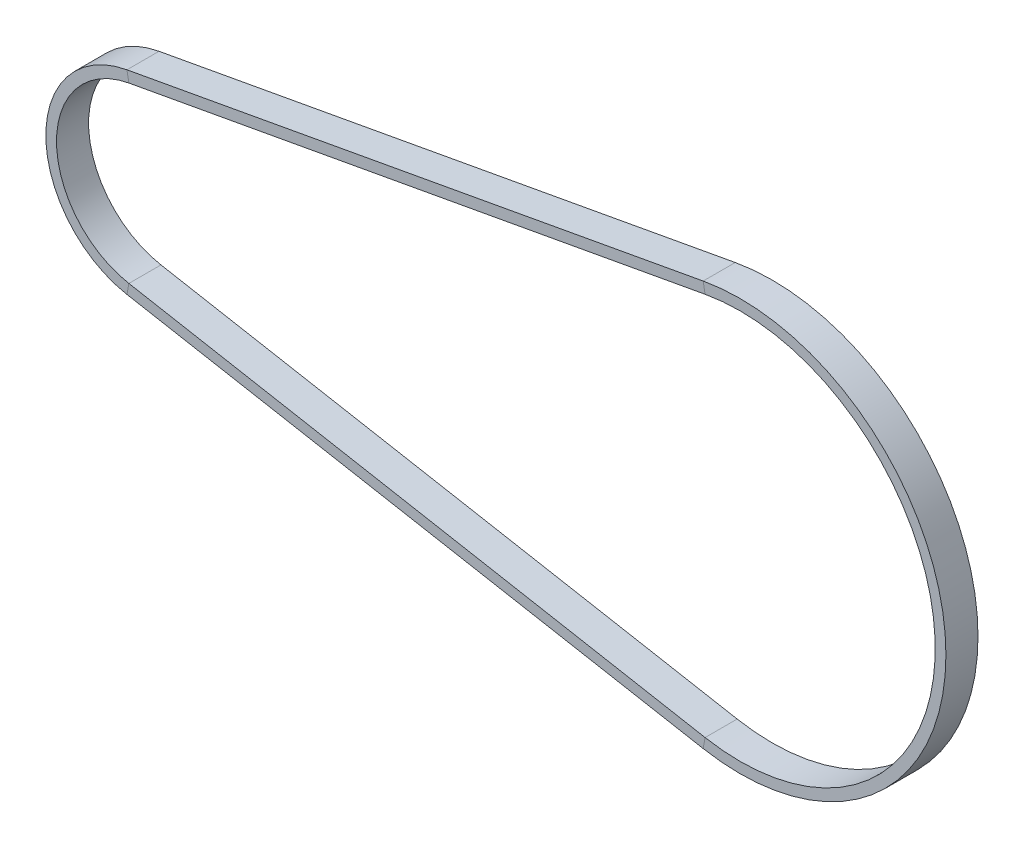
ISO-10303-21;
HEADER;
FILE_DESCRIPTION(('STEP AP214'),'2;1');
FILE_NAME('part.step','',(''),(''),'','','');
FILE_SCHEMA(('AUTOMOTIVE_DESIGN { 1 0 10303 214 1 1 1 1 }'));
ENDSEC;
DATA;
#1=APPLICATION_CONTEXT('core data for automotive mechanical design processes');
#2=APPLICATION_PROTOCOL_DEFINITION('international standard','automotive_design',2000,#1);
#3=PRODUCT_CONTEXT('',#1,'mechanical');
#4=PRODUCT('Part','Part','',(#3));
#5=PRODUCT_RELATED_PRODUCT_CATEGORY('part','',(#4));
#6=PRODUCT_DEFINITION_FORMATION('','',#4);
#7=PRODUCT_DEFINITION_CONTEXT('part definition',#1,'design');
#8=PRODUCT_DEFINITION('design','',#6,#7);
#9=PRODUCT_DEFINITION_SHAPE('','',#8);
#10=(LENGTH_UNIT() NAMED_UNIT(*) SI_UNIT(.MILLI.,.METRE.));
#11=(NAMED_UNIT(*) PLANE_ANGLE_UNIT() SI_UNIT($,.RADIAN.));
#12=(NAMED_UNIT(*) SI_UNIT($,.STERADIAN.) SOLID_ANGLE_UNIT());
#13=UNCERTAINTY_MEASURE_WITH_UNIT(LENGTH_MEASURE(1.E-05),#10,'distance_accuracy_value','');
#14=(GEOMETRIC_REPRESENTATION_CONTEXT(3) GLOBAL_UNCERTAINTY_ASSIGNED_CONTEXT((#13)) GLOBAL_UNIT_ASSIGNED_CONTEXT((#10,
#11,#12)) REPRESENTATION_CONTEXT('',''));
#15=CARTESIAN_POINT('',(0.,0.,0.));
#16=DIRECTION('',(0.,0.,1.));
#17=DIRECTION('',(1.,0.,0.));
#18=AXIS2_PLACEMENT_3D('',#15,#16,#17);
#19=CARTESIAN_POINT('',(-57.3205845497318,0.,0.));
#20=DIRECTION('',(0.,0.,-1.));
#21=DIRECTION('',(-1.,0.,0.));
#22=AXIS2_PLACEMENT_3D('',#19,#20,#21);
#23=CYLINDRICAL_SURFACE('',#22,16.5);
#24=CARTESIAN_POINT('',(-57.3205845497318,0.,3.));
#25=DIRECTION('',(0.,0.,-1.));
#26=DIRECTION('',(-0.179558490927269,-0.983747299023444,0.));
#27=AXIS2_PLACEMENT_3D('',#24,#25,#26);
#28=CIRCLE('',#27,16.5);
#29=CARTESIAN_POINT('',(-60.2832996500317,-16.2318304338868,3.));
#30=VERTEX_POINT('',#29);
#31=CARTESIAN_POINT('',(-60.2832996500317,16.2318304338868,3.));
#32=VERTEX_POINT('',#31);
#33=EDGE_CURVE('E11',#30,#32,#28,.T.);
#34=ORIENTED_EDGE('',*,*,#33,.F.);
#35=DIRECTION('',(0.,0.,-1.));
#36=VECTOR('',#35,1.);
#37=CARTESIAN_POINT('',(-60.2832996500317,-16.2318304338868,3.));
#38=LINE('',#37,#36);
#39=CARTESIAN_POINT('',(-60.2832996500317,-16.2318304338868,-3.));
#40=VERTEX_POINT('',#39);
#41=EDGE_CURVE('E46',#30,#40,#38,.T.);
#42=ORIENTED_EDGE('',*,*,#41,.T.);
#43=CARTESIAN_POINT('',(-57.3205845497318,0.,-3.));
#44=DIRECTION('',(0.,0.,-1.));
#45=DIRECTION('',(-0.179558490927269,-0.983747299023444,0.));
#46=AXIS2_PLACEMENT_3D('',#43,#44,#45);
#47=CIRCLE('',#46,16.5);
#48=CARTESIAN_POINT('',(-60.2832996500317,16.2318304338868,-3.));
#49=VERTEX_POINT('',#48);
#50=EDGE_CURVE('E123',#40,#49,#47,.T.);
#51=ORIENTED_EDGE('',*,*,#50,.T.);
#52=DIRECTION('',(0.,0.,-1.));
#53=VECTOR('',#52,1.);
#54=CARTESIAN_POINT('',(-60.2832996500317,16.2318304338868,3.));
#55=LINE('',#54,#53);
#56=EDGE_CURVE('E126',#32,#49,#55,.T.);
#57=ORIENTED_EDGE('',*,*,#56,.F.);
#58=EDGE_LOOP('',(#34,#42,#51,#57));
#59=FACE_BOUND('',#58,.T.);
#60=ADVANCED_FACE('F43',(#59),#23,.F.);
#61=CARTESIAN_POINT('',(-60.2832996500317,-16.2318304338868,3.));
#62=DIRECTION('',(0.,0.,1.));
#63=DIRECTION('',(1.,0.,0.));
#64=AXIS2_PLACEMENT_3D('',#61,#62,#63);
#65=PLANE('',#64);
#66=CARTESIAN_POINT('',(-57.3205845497318,0.,3.));
#67=DIRECTION('',(0.,0.,-1.));
#68=DIRECTION('',(-0.179558490927269,-0.983747299023444,0.));
#69=AXIS2_PLACEMENT_3D('',#66,#67,#68);
#70=CIRCLE('',#69,18.5);
#71=CARTESIAN_POINT('',(-60.6424166318863,-18.1993250319337,3.));
#72=VERTEX_POINT('',#71);
#73=CARTESIAN_POINT('',(-60.6424166318863,18.1993250319337,3.));
#74=VERTEX_POINT('',#73);
#75=EDGE_CURVE('E52',#72,#74,#70,.T.);
#76=ORIENTED_EDGE('',*,*,#75,.F.);
#77=DIRECTION('',(0.179558490927269,0.983747299023444,0.));
#78=VECTOR('',#77,1.);
#79=CARTESIAN_POINT('',(-60.2832996500317,-16.2318304338868,3.));
#80=LINE('',#79,#78);
#81=EDGE_CURVE('E216',#72,#30,#80,.T.);
#82=ORIENTED_EDGE('',*,*,#81,.T.);
#83=ORIENTED_EDGE('',*,*,#33,.T.);
#84=DIRECTION('',(0.179558490927267,-0.983747299023444,0.));
#85=VECTOR('',#84,1.);
#86=CARTESIAN_POINT('',(-60.2832996500317,16.2318304338868,3.));
#87=LINE('',#86,#85);
#88=EDGE_CURVE('E153',#74,#32,#87,.T.);
#89=ORIENTED_EDGE('',*,*,#88,.F.);
#90=EDGE_LOOP('',(#76,#82,#83,#89));
#91=FACE_BOUND('',#90,.T.);
#92=ADVANCED_FACE('F265',(#91),#65,.T.);
#93=CARTESIAN_POINT('',(-57.3205845497318,0.,0.));
#94=DIRECTION('',(0.,0.,-1.));
#95=DIRECTION('',(-1.,0.,0.));
#96=AXIS2_PLACEMENT_3D('',#93,#94,#95);
#97=CYLINDRICAL_SURFACE('',#96,18.5);
#98=CARTESIAN_POINT('',(-57.3205845497318,0.,-3.));
#99=DIRECTION('',(0.,0.,-1.));
#100=DIRECTION('',(-0.179558490927269,-0.983747299023444,0.));
#101=AXIS2_PLACEMENT_3D('',#98,#99,#100);
#102=CIRCLE('',#101,18.5);
#103=CARTESIAN_POINT('',(-60.6424166318863,-18.1993250319337,-3.));
#104=VERTEX_POINT('',#103);
#105=CARTESIAN_POINT('',(-60.6424166318863,18.1993250319337,-3.));
#106=VERTEX_POINT('',#105);
#107=EDGE_CURVE('E133',#104,#106,#102,.T.);
#108=ORIENTED_EDGE('',*,*,#107,.F.);
#109=DIRECTION('',(0.,0.,1.));
#110=VECTOR('',#109,1.);
#111=CARTESIAN_POINT('',(-60.6424166318863,-18.1993250319337,3.));
#112=LINE('',#111,#110);
#113=EDGE_CURVE('E189',#104,#72,#112,.T.);
#114=ORIENTED_EDGE('',*,*,#113,.T.);
#115=ORIENTED_EDGE('',*,*,#75,.T.);
#116=DIRECTION('',(0.,0.,1.));
#117=VECTOR('',#116,1.);
#118=CARTESIAN_POINT('',(-60.6424166318863,18.1993250319337,3.));
#119=LINE('',#118,#117);
#120=EDGE_CURVE('E158',#106,#74,#119,.T.);
#121=ORIENTED_EDGE('',*,*,#120,.F.);
#122=EDGE_LOOP('',(#108,#114,#115,#121));
#123=FACE_BOUND('',#122,.T.);
#124=ADVANCED_FACE('F269',(#123),#97,.T.);
#125=CARTESIAN_POINT('',(47.5098482360153,-35.9067764143557,3.));
#126=DIRECTION('',(0.179558490927268,0.983747299023444,0.));
#127=DIRECTION('',(-0.983747299023445,0.179558490927268,0.));
#128=AXIS2_PLACEMENT_3D('',#125,#126,#127);
#129=PLANE('',#128);
#130=ORIENTED_EDGE('',*,*,#41,.F.);
#131=DIRECTION('',(-0.983747299023444,0.179558490927268,0.));
#132=VECTOR('',#131,1.);
#133=CARTESIAN_POINT('',(47.5098482360153,-35.9067764143557,3.));
#134=LINE('',#133,#132);
#135=CARTESIAN_POINT('',(47.5098482360153,-35.9067764143557,3.));
#136=VERTEX_POINT('',#135);
#137=EDGE_CURVE('E232',#136,#30,#134,.T.);
#138=ORIENTED_EDGE('',*,*,#137,.F.);
#139=DIRECTION('',(0.,0.,-1.));
#140=VECTOR('',#139,1.);
#141=CARTESIAN_POINT('',(47.5098482360153,-35.9067764143557,3.));
#142=LINE('',#141,#140);
#143=CARTESIAN_POINT('',(47.5098482360153,-35.9067764143557,-3.));
#144=VERTEX_POINT('',#143);
#145=EDGE_CURVE('E193',#136,#144,#142,.T.);
#146=ORIENTED_EDGE('',*,*,#145,.T.);
#147=DIRECTION('',(-0.983747299023444,0.179558490927268,0.));
#148=VECTOR('',#147,1.);
#149=CARTESIAN_POINT('',(47.5098482360153,-35.9067764143557,-3.));
#150=LINE('',#149,#148);
#151=EDGE_CURVE('E185',#144,#40,#150,.T.);
#152=ORIENTED_EDGE('',*,*,#151,.T.);
#153=EDGE_LOOP('',(#130,#138,#146,#152));
#154=FACE_BOUND('',#153,.T.);
#155=ADVANCED_FACE('F242',(#154),#129,.T.);
#156=CARTESIAN_POINT('',(47.5098482360153,-35.9067764143557,3.));
#157=DIRECTION('',(0.,0.,1.));
#158=DIRECTION('',(1.,0.,0.));
#159=AXIS2_PLACEMENT_3D('',#156,#157,#158);
#160=PLANE('',#159);
#161=ORIENTED_EDGE('',*,*,#137,.T.);
#162=ORIENTED_EDGE('',*,*,#81,.F.);
#163=DIRECTION('',(-0.983747299023444,0.179558490927268,0.));
#164=VECTOR('',#163,1.);
#165=CARTESIAN_POINT('',(47.1507312541608,-37.8742710124026,3.));
#166=LINE('',#165,#164);
#167=CARTESIAN_POINT('',(47.1507312541608,-37.8742710124026,3.));
#168=VERTEX_POINT('',#167);
#169=EDGE_CURVE('E212',#168,#72,#166,.T.);
#170=ORIENTED_EDGE('',*,*,#169,.F.);
#171=DIRECTION('',(0.179558490927271,0.983747299023444,0.));
#172=VECTOR('',#171,1.);
#173=CARTESIAN_POINT('',(47.5098482360153,-35.9067764143557,3.));
#174=LINE('',#173,#172);
#175=EDGE_CURVE('E206',#168,#136,#174,.T.);
#176=ORIENTED_EDGE('',*,*,#175,.T.);
#177=EDGE_LOOP('',(#161,#162,#170,#176));
#178=FACE_BOUND('',#177,.T.);
#179=ADVANCED_FACE('F278',(#178),#160,.T.);
#180=CARTESIAN_POINT('',(47.1507312541608,-37.8742710124026,3.));
#181=DIRECTION('',(-0.179558490927268,-0.983747299023444,0.));
#182=DIRECTION('',(0.983747299023445,-0.179558490927268,0.));
#183=AXIS2_PLACEMENT_3D('',#180,#181,#182);
#184=PLANE('',#183);
#185=ORIENTED_EDGE('',*,*,#169,.T.);
#186=ORIENTED_EDGE('',*,*,#113,.F.);
#187=DIRECTION('',(-0.983747299023444,0.179558490927268,0.));
#188=VECTOR('',#187,1.);
#189=CARTESIAN_POINT('',(47.1507312541608,-37.8742710124026,-3.));
#190=LINE('',#189,#188);
#191=CARTESIAN_POINT('',(47.1507312541608,-37.8742710124026,-3.));
#192=VERTEX_POINT('',#191);
#193=EDGE_CURVE('E184',#192,#104,#190,.T.);
#194=ORIENTED_EDGE('',*,*,#193,.F.);
#195=DIRECTION('',(0.,0.,1.));
#196=VECTOR('',#195,1.);
#197=CARTESIAN_POINT('',(47.1507312541608,-37.8742710124026,3.));
#198=LINE('',#197,#196);
#199=EDGE_CURVE('E174',#192,#168,#198,.T.);
#200=ORIENTED_EDGE('',*,*,#199,.T.);
#201=EDGE_LOOP('',(#185,#186,#194,#200));
#202=FACE_BOUND('',#201,.T.);
#203=ADVANCED_FACE('F250',(#202),#184,.T.);
#204=CARTESIAN_POINT('',(47.5098482360153,-35.9067764143557,-3.));
#205=DIRECTION('',(0.,0.,-1.));
#206=DIRECTION('',(-1.,0.,0.));
#207=AXIS2_PLACEMENT_3D('',#204,#205,#206);
#208=PLANE('',#207);
#209=ORIENTED_EDGE('',*,*,#193,.T.);
#210=DIRECTION('',(-0.179558490927268,-0.983747299023444,0.));
#211=VECTOR('',#210,1.);
#212=CARTESIAN_POINT('',(-60.2832996500317,-16.2318304338868,-3.));
#213=LINE('',#212,#211);
#214=EDGE_CURVE('E181',#40,#104,#213,.T.);
#215=ORIENTED_EDGE('',*,*,#214,.F.);
#216=ORIENTED_EDGE('',*,*,#151,.F.);
#217=DIRECTION('',(-0.179558490927271,-0.983747299023444,0.));
#218=VECTOR('',#217,1.);
#219=CARTESIAN_POINT('',(47.5098482360153,-35.9067764143557,-3.));
#220=LINE('',#219,#218);
#221=EDGE_CURVE('E170',#144,#192,#220,.T.);
#222=ORIENTED_EDGE('',*,*,#221,.T.);
#223=EDGE_LOOP('',(#209,#215,#216,#222));
#224=FACE_BOUND('',#223,.T.);
#225=ADVANCED_FACE('F247',(#224),#208,.T.);
#226=CARTESIAN_POINT('',(54.0637331548607,0.,0.));
#227=DIRECTION('',(0.,0.,-1.));
#228=DIRECTION('',(-1.,0.,0.));
#229=AXIS2_PLACEMENT_3D('',#226,#227,#228);
#230=CYLINDRICAL_SURFACE('',#229,36.5);
#231=ORIENTED_EDGE('',*,*,#145,.F.);
#232=CARTESIAN_POINT('',(54.0637331548607,0.,3.));
#233=DIRECTION('',(0.,0.,-1.));
#234=DIRECTION('',(-0.179558490927268,0.983747299023444,0.));
#235=AXIS2_PLACEMENT_3D('',#232,#233,#234);
#236=CIRCLE('',#235,36.5);
#237=CARTESIAN_POINT('',(47.5098482360154,35.9067764143557,3.));
#238=VERTEX_POINT('',#237);
#239=EDGE_CURVE('E88',#238,#136,#236,.T.);
#240=ORIENTED_EDGE('',*,*,#239,.F.);
#241=DIRECTION('',(0.,0.,-1.));
#242=VECTOR('',#241,1.);
#243=CARTESIAN_POINT('',(47.5098482360154,35.9067764143557,3.));
#244=LINE('',#243,#242);
#245=CARTESIAN_POINT('',(47.5098482360154,35.9067764143557,-3.));
#246=VERTEX_POINT('',#245);
#247=EDGE_CURVE('E180',#238,#246,#244,.T.);
#248=ORIENTED_EDGE('',*,*,#247,.T.);
#249=CARTESIAN_POINT('',(54.0637331548607,0.,-3.));
#250=DIRECTION('',(0.,0.,-1.));
#251=DIRECTION('',(-0.179558490927268,0.983747299023444,0.));
#252=AXIS2_PLACEMENT_3D('',#249,#250,#251);
#253=CIRCLE('',#252,36.5);
#254=EDGE_CURVE('E177',#246,#144,#253,.T.);
#255=ORIENTED_EDGE('',*,*,#254,.T.);
#256=EDGE_LOOP('',(#231,#240,#248,#255));
#257=FACE_BOUND('',#256,.T.);
#258=ADVANCED_FACE('F260',(#257),#230,.F.);
#259=CARTESIAN_POINT('',(47.5098482360154,35.9067764143557,3.));
#260=DIRECTION('',(0.,0.,1.));
#261=DIRECTION('',(1.,0.,0.));
#262=AXIS2_PLACEMENT_3D('',#259,#260,#261);
#263=PLANE('',#262);
#264=ORIENTED_EDGE('',*,*,#239,.T.);
#265=ORIENTED_EDGE('',*,*,#175,.F.);
#266=CARTESIAN_POINT('',(54.0637331548607,0.,3.));
#267=DIRECTION('',(0.,0.,-1.));
#268=DIRECTION('',(-0.179558490927268,0.983747299023444,0.));
#269=AXIS2_PLACEMENT_3D('',#266,#267,#268);
#270=CIRCLE('',#269,38.5);
#271=CARTESIAN_POINT('',(47.1507312541608,37.8742710124026,3.));
#272=VERTEX_POINT('',#271);
#273=EDGE_CURVE('E98',#272,#168,#270,.T.);
#274=ORIENTED_EDGE('',*,*,#273,.F.);
#275=DIRECTION('',(0.179558490927267,-0.983747299023444,0.));
#276=VECTOR('',#275,1.);
#277=CARTESIAN_POINT('',(47.5098482360154,35.9067764143557,3.));
#278=LINE('',#277,#276);
#279=EDGE_CURVE('E202',#272,#238,#278,.T.);
#280=ORIENTED_EDGE('',*,*,#279,.T.);
#281=EDGE_LOOP('',(#264,#265,#274,#280));
#282=FACE_BOUND('',#281,.T.);
#283=ADVANCED_FACE('F253',(#282),#263,.T.);
#284=CARTESIAN_POINT('',(54.0637331548607,0.,0.));
#285=DIRECTION('',(0.,0.,-1.));
#286=DIRECTION('',(-1.,0.,0.));
#287=AXIS2_PLACEMENT_3D('',#284,#285,#286);
#288=CYLINDRICAL_SURFACE('',#287,38.5);
#289=ORIENTED_EDGE('',*,*,#273,.T.);
#290=ORIENTED_EDGE('',*,*,#199,.F.);
#291=CARTESIAN_POINT('',(54.0637331548607,0.,-3.));
#292=DIRECTION('',(0.,0.,-1.));
#293=DIRECTION('',(-0.179558490927268,0.983747299023444,0.));
#294=AXIS2_PLACEMENT_3D('',#291,#292,#293);
#295=CIRCLE('',#294,38.5);
#296=CARTESIAN_POINT('',(47.1507312541608,37.8742710124026,-3.));
#297=VERTEX_POINT('',#296);
#298=EDGE_CURVE('E106',#297,#192,#295,.T.);
#299=ORIENTED_EDGE('',*,*,#298,.F.);
#300=DIRECTION('',(0.,0.,1.));
#301=VECTOR('',#300,1.);
#302=CARTESIAN_POINT('',(47.1507312541608,37.8742710124026,3.));
#303=LINE('',#302,#301);
#304=EDGE_CURVE('E168',#297,#272,#303,.T.);
#305=ORIENTED_EDGE('',*,*,#304,.T.);
#306=EDGE_LOOP('',(#289,#290,#299,#305));
#307=FACE_BOUND('',#306,.T.);
#308=ADVANCED_FACE('F251',(#307),#288,.T.);
#309=CARTESIAN_POINT('',(47.5098482360154,35.9067764143558,-3.));
#310=DIRECTION('',(0.,0.,-1.));
#311=DIRECTION('',(-1.,0.,0.));
#312=AXIS2_PLACEMENT_3D('',#309,#310,#311);
#313=PLANE('',#312);
#314=ORIENTED_EDGE('',*,*,#298,.T.);
#315=ORIENTED_EDGE('',*,*,#221,.F.);
#316=ORIENTED_EDGE('',*,*,#254,.F.);
#317=DIRECTION('',(-0.179558490927268,0.983747299023444,0.));
#318=VECTOR('',#317,1.);
#319=CARTESIAN_POINT('',(47.5098482360154,35.9067764143557,-3.));
#320=LINE('',#319,#318);
#321=EDGE_CURVE('E143',#246,#297,#320,.T.);
#322=ORIENTED_EDGE('',*,*,#321,.T.);
#323=EDGE_LOOP('',(#314,#315,#316,#322));
#324=FACE_BOUND('',#323,.T.);
#325=ADVANCED_FACE('F245',(#324),#313,.T.);
#326=CARTESIAN_POINT('',(-60.2832996500317,16.2318304338868,3.));
#327=DIRECTION('',(0.179558490927268,-0.983747299023444,0.));
#328=DIRECTION('',(0.983747299023444,0.179558490927268,0.));
#329=AXIS2_PLACEMENT_3D('',#326,#327,#328);
#330=PLANE('',#329);
#331=ORIENTED_EDGE('',*,*,#247,.F.);
#332=DIRECTION('',(0.983747299023444,0.179558490927268,0.));
#333=VECTOR('',#332,1.);
#334=CARTESIAN_POINT('',(-60.2832996500317,16.2318304338868,3.));
#335=LINE('',#334,#333);
#336=EDGE_CURVE('E151',#32,#238,#335,.T.);
#337=ORIENTED_EDGE('',*,*,#336,.F.);
#338=ORIENTED_EDGE('',*,*,#56,.T.);
#339=DIRECTION('',(0.983747299023444,0.179558490927268,0.));
#340=VECTOR('',#339,1.);
#341=CARTESIAN_POINT('',(-60.2832996500317,16.2318304338868,-3.));
#342=LINE('',#341,#340);
#343=EDGE_CURVE('E139',#49,#246,#342,.T.);
#344=ORIENTED_EDGE('',*,*,#343,.T.);
#345=EDGE_LOOP('',(#331,#337,#338,#344));
#346=FACE_BOUND('',#345,.T.);
#347=ADVANCED_FACE('F149',(#346),#330,.T.);
#348=CARTESIAN_POINT('',(-60.2832996500317,16.2318304338868,3.));
#349=DIRECTION('',(0.,0.,1.));
#350=DIRECTION('',(1.,0.,0.));
#351=AXIS2_PLACEMENT_3D('',#348,#349,#350);
#352=PLANE('',#351);
#353=ORIENTED_EDGE('',*,*,#336,.T.);
#354=ORIENTED_EDGE('',*,*,#279,.F.);
#355=DIRECTION('',(0.983747299023444,0.179558490927268,0.));
#356=VECTOR('',#355,1.);
#357=CARTESIAN_POINT('',(-60.6424166318863,18.1993250319337,3.));
#358=LINE('',#357,#356);
#359=EDGE_CURVE('E198',#74,#272,#358,.T.);
#360=ORIENTED_EDGE('',*,*,#359,.F.);
#361=ORIENTED_EDGE('',*,*,#88,.T.);
#362=EDGE_LOOP('',(#353,#354,#360,#361));
#363=FACE_BOUND('',#362,.T.);
#364=ADVANCED_FACE('F281',(#363),#352,.T.);
#365=CARTESIAN_POINT('',(-60.6424166318863,18.1993250319337,3.));
#366=DIRECTION('',(-0.179558490927268,0.983747299023444,0.));
#367=DIRECTION('',(-0.983747299023444,-0.179558490927268,0.));
#368=AXIS2_PLACEMENT_3D('',#365,#366,#367);
#369=PLANE('',#368);
#370=ORIENTED_EDGE('',*,*,#359,.T.);
#371=ORIENTED_EDGE('',*,*,#304,.F.);
#372=DIRECTION('',(0.983747299023444,0.179558490927268,0.));
#373=VECTOR('',#372,1.);
#374=CARTESIAN_POINT('',(-60.6424166318863,18.1993250319337,-3.));
#375=LINE('',#374,#373);
#376=EDGE_CURVE('E166',#106,#297,#375,.T.);
#377=ORIENTED_EDGE('',*,*,#376,.F.);
#378=ORIENTED_EDGE('',*,*,#120,.T.);
#379=EDGE_LOOP('',(#370,#371,#377,#378));
#380=FACE_BOUND('',#379,.T.);
#381=ADVANCED_FACE('F295',(#380),#369,.T.);
#382=CARTESIAN_POINT('',(-60.2832996500317,16.2318304338868,-3.));
#383=DIRECTION('',(0.,0.,-1.));
#384=DIRECTION('',(-1.,0.,0.));
#385=AXIS2_PLACEMENT_3D('',#382,#383,#384);
#386=PLANE('',#385);
#387=ORIENTED_EDGE('',*,*,#376,.T.);
#388=ORIENTED_EDGE('',*,*,#321,.F.);
#389=ORIENTED_EDGE('',*,*,#343,.F.);
#390=DIRECTION('',(-0.179558490927268,0.983747299023444,0.));
#391=VECTOR('',#390,1.);
#392=CARTESIAN_POINT('',(-60.2832996500317,16.2318304338868,-3.));
#393=LINE('',#392,#391);
#394=EDGE_CURVE('E142',#49,#106,#393,.T.);
#395=ORIENTED_EDGE('',*,*,#394,.T.);
#396=EDGE_LOOP('',(#387,#388,#389,#395));
#397=FACE_BOUND('',#396,.T.);
#398=ADVANCED_FACE('F141',(#397),#386,.T.);
#399=CARTESIAN_POINT('',(-60.2832996500318,-16.2318304338868,-3.));
#400=DIRECTION('',(0.,0.,-1.));
#401=DIRECTION('',(-1.,0.,0.));
#402=AXIS2_PLACEMENT_3D('',#399,#400,#401);
#403=PLANE('',#402);
#404=ORIENTED_EDGE('',*,*,#214,.T.);
#405=ORIENTED_EDGE('',*,*,#107,.T.);
#406=ORIENTED_EDGE('',*,*,#394,.F.);
#407=ORIENTED_EDGE('',*,*,#50,.F.);
#408=EDGE_LOOP('',(#404,#405,#406,#407));
#409=FACE_BOUND('',#408,.T.);
#410=ADVANCED_FACE('F155',(#409),#403,.T.);
#411=CLOSED_SHELL('',(#60,#92,#124,#155,#179,#203,#225,#258,#283,#308,#325,#347,#364,#381,#398,#410));
#412=MANIFOLD_SOLID_BREP('B2',#411);
#413=ADVANCED_BREP_SHAPE_REPRESENTATION('',(#18,#412),#14);
#414=SHAPE_DEFINITION_REPRESENTATION(#9,#413);
ENDSEC;
END-ISO-10303-21;
